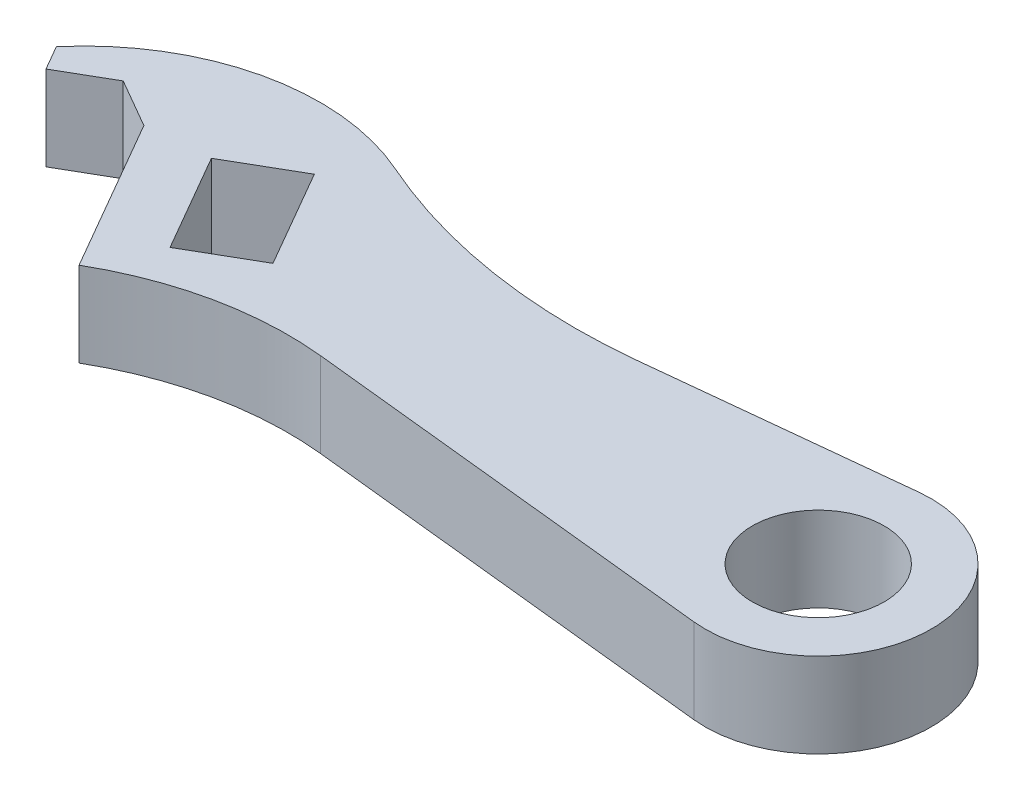
ISO-10303-21;
HEADER;
FILE_DESCRIPTION(('STEP AP214'),'2;1');
FILE_NAME('part.step','',(''),(''),'','','');
FILE_SCHEMA(('AUTOMOTIVE_DESIGN { 1 0 10303 214 1 1 1 1 }'));
ENDSEC;
DATA;
#1=APPLICATION_CONTEXT('core data for automotive mechanical design processes');
#2=APPLICATION_PROTOCOL_DEFINITION('international standard','automotive_design',2000,#1);
#3=PRODUCT_CONTEXT('',#1,'mechanical');
#4=PRODUCT('Part','Part','',(#3));
#5=PRODUCT_RELATED_PRODUCT_CATEGORY('part','',(#4));
#6=PRODUCT_DEFINITION_FORMATION('','',#4);
#7=PRODUCT_DEFINITION_CONTEXT('part definition',#1,'design');
#8=PRODUCT_DEFINITION('design','',#6,#7);
#9=PRODUCT_DEFINITION_SHAPE('','',#8);
#10=(LENGTH_UNIT() NAMED_UNIT(*) SI_UNIT(.MILLI.,.METRE.));
#11=(NAMED_UNIT(*) PLANE_ANGLE_UNIT() SI_UNIT($,.RADIAN.));
#12=(NAMED_UNIT(*) SI_UNIT($,.STERADIAN.) SOLID_ANGLE_UNIT());
#13=UNCERTAINTY_MEASURE_WITH_UNIT(LENGTH_MEASURE(1.E-05),#10,'distance_accuracy_value','');
#14=(GEOMETRIC_REPRESENTATION_CONTEXT(3) GLOBAL_UNCERTAINTY_ASSIGNED_CONTEXT((#13)) GLOBAL_UNIT_ASSIGNED_CONTEXT((#10,
#11,#12)) REPRESENTATION_CONTEXT('',''));
#15=CARTESIAN_POINT('',(0.,0.,0.));
#16=DIRECTION('',(0.,0.,1.));
#17=DIRECTION('',(1.,0.,0.));
#18=AXIS2_PLACEMENT_3D('',#15,#16,#17);
#19=CARTESIAN_POINT('',(-68.8797696951043,4.5,9.00000000000001));
#20=DIRECTION('',(0.,1.,0.));
#21=DIRECTION('',(0.,0.,1.));
#22=AXIS2_PLACEMENT_3D('',#19,#20,#21);
#23=PLANE('',#22);
#24=CARTESIAN_POINT('',(-68.8797696951043,4.5,9.00000000000001));
#25=DIRECTION('',(0.,1.,0.));
#26=DIRECTION('',(0.,0.,1.));
#27=AXIS2_PLACEMENT_3D('',#24,#25,#26);
#28=CIRCLE('',#27,25.);
#29=CARTESIAN_POINT('',(-58.7861227034071,4.5,-13.8717793450138));
#30=VERTEX_POINT('',#29);
#31=CARTESIAN_POINT('',(-88.,4.5,-7.10642086522472));
#32=VERTEX_POINT('',#31);
#33=EDGE_CURVE('E201',#30,#32,#28,.T.);
#34=ORIENTED_EDGE('',*,*,#33,.T.);
#35=DIRECTION('',(0.499999999999996,0.,0.866025403784441));
#36=VECTOR('',#35,1.);
#37=CARTESIAN_POINT('',(-88.,4.5,-7.10642086522472));
#38=LINE('',#37,#36);
#39=CARTESIAN_POINT('',(-86.5,4.5,-4.5083446538714));
#40=VERTEX_POINT('',#39);
#41=EDGE_CURVE('E210',#32,#40,#38,.T.);
#42=ORIENTED_EDGE('',*,*,#41,.T.);
#43=DIRECTION('',(0.866025403784441,0.,-0.499999999999997));
#44=VECTOR('',#43,1.);
#45=CARTESIAN_POINT('',(-86.5,4.5,-4.5083446538714));
#46=LINE('',#45,#44);
#47=CARTESIAN_POINT('',(-81.3038475772934,4.5,-7.50834465387138));
#48=VERTEX_POINT('',#47);
#49=EDGE_CURVE('E211',#40,#48,#46,.T.);
#50=ORIENTED_EDGE('',*,*,#49,.T.);
#51=DIRECTION('',(0.866025403784438,0.,0.500000000000001));
#52=VECTOR('',#51,1.);
#53=CARTESIAN_POINT('',(-81.3038475772934,4.5,-7.50834465387138));
#54=LINE('',#53,#52);
#55=CARTESIAN_POINT('',(-76.1076951545868,4.5,-4.50834465387138));
#56=VERTEX_POINT('',#55);
#57=EDGE_CURVE('E212',#48,#56,#54,.T.);
#58=ORIENTED_EDGE('',*,*,#57,.T.);
#59=DIRECTION('',(0.499999999999998,0.,0.86602540378444));
#60=VECTOR('',#59,1.);
#61=CARTESIAN_POINT('',(-76.1076951545868,4.5,-4.50834465387138));
#62=LINE('',#61,#60);
#63=CARTESIAN_POINT('',(-66.7057713659401,4.5,11.7762650369552));
#64=VERTEX_POINT('',#63);
#65=EDGE_CURVE('E220',#56,#64,#62,.T.);
#66=ORIENTED_EDGE('',*,*,#65,.T.);
#67=CARTESIAN_POINT('',(-49.2057713659402,4.5,42.0871541694106));
#68=DIRECTION('',(0.,-1.,0.));
#69=DIRECTION('',(0.,0.,1.));
#70=AXIS2_PLACEMENT_3D('',#67,#68,#69);
#71=CIRCLE('',#70,35.);
#72=CARTESIAN_POINT('',(-45.5472751515725,4.5,7.278887831521));
#73=VERTEX_POINT('',#72);
#74=EDGE_CURVE('E219',#64,#73,#71,.T.);
#75=ORIENTED_EDGE('',*,*,#74,.T.);
#76=DIRECTION('',(0.994521895368274,0.,0.10452846326765));
#77=VECTOR('',#76,1.);
#78=CARTESIAN_POINT('',(-45.5472751515725,4.5,7.278887831521));
#79=LINE('',#78,#77);
#80=CARTESIAN_POINT('',(-1.2543415592118,4.5,11.9342627444193));
#81=VERTEX_POINT('',#80);
#82=EDGE_CURVE('E224',#73,#81,#79,.T.);
#83=ORIENTED_EDGE('',*,*,#82,.T.);
#84=CARTESIAN_POINT('',(0.,4.5,0.));
#85=DIRECTION('',(0.,1.,0.));
#86=DIRECTION('',(0.,0.,1.));
#87=AXIS2_PLACEMENT_3D('',#84,#85,#86);
#88=CIRCLE('',#87,12.);
#89=CARTESIAN_POINT('',(-1.2543415592118,4.5,-11.9342627444193));
#90=VERTEX_POINT('',#89);
#91=EDGE_CURVE('E227',#81,#90,#88,.T.);
#92=ORIENTED_EDGE('',*,*,#91,.T.);
#93=DIRECTION('',(-0.994521895368274,0.,0.10452846326765));
#94=VECTOR('',#93,1.);
#95=CARTESIAN_POINT('',(-1.2543415592118,4.5,-11.9342627444193));
#96=LINE('',#95,#94);
#97=CARTESIAN_POINT('',(-28.2896621272748,4.5,-9.09273605095071));
#98=VERTEX_POINT('',#97);
#99=EDGE_CURVE('E226',#90,#98,#96,.T.);
#100=ORIENTED_EDGE('',*,*,#99,.T.);
#101=CARTESIAN_POINT('',(-34.5613699233339,4.5,-68.7640497730471));
#102=DIRECTION('',(0.,-1.,0.));
#103=DIRECTION('',(0.,0.,-1.));
#104=AXIS2_PLACEMENT_3D('',#101,#102,#103);
#105=CIRCLE('',#104,60.);
#106=EDGE_CURVE('E232',#98,#30,#105,.T.);
#107=ORIENTED_EDGE('',*,*,#106,.T.);
#108=EDGE_LOOP('',(#34,#42,#50,#58,#66,#75,#83,#92,#100,#107));
#109=FACE_BOUND('',#108,.T.);
#110=CARTESIAN_POINT('',(0.,4.5,0.));
#111=DIRECTION('',(0.,1.,0.));
#112=DIRECTION('',(0.,0.,1.));
#113=AXIS2_PLACEMENT_3D('',#110,#111,#112);
#114=CIRCLE('',#113,7.);
#115=CARTESIAN_POINT('',(0.,4.5,7.));
#116=VERTEX_POINT('',#115);
#117=EDGE_CURVE('E195',#116,#116,#114,.T.);
#118=ORIENTED_EDGE('',*,*,#117,.F.);
#119=EDGE_LOOP('',(#118));
#120=FACE_BOUND('',#119,.T.);
#121=DIRECTION('',(0.499999999999998,0.,0.86602540378444));
#122=VECTOR('',#121,1.);
#123=CARTESIAN_POINT('',(-69.5096189432334,4.5,-5.08014142359585));
#124=LINE('',#123,#122);
#125=CARTESIAN_POINT('',(-69.5096189432334,4.5,-5.08014142359585));
#126=VERTEX_POINT('',#125);
#127=CARTESIAN_POINT('',(-63.5096189432335,4.5,5.31216342181743));
#128=VERTEX_POINT('',#127);
#129=EDGE_CURVE('E156',#126,#128,#124,.T.);
#130=ORIENTED_EDGE('',*,*,#129,.F.);
#131=DIRECTION('',(-0.86602540378444,0.,0.499999999999998));
#132=VECTOR('',#131,1.);
#133=CARTESIAN_POINT('',(-62.5814157129579,4.5,-9.08014142359582));
#134=LINE('',#133,#132);
#135=CARTESIAN_POINT('',(-62.5814157129579,4.5,-9.08014142359582));
#136=VERTEX_POINT('',#135);
#137=EDGE_CURVE('E150',#136,#126,#134,.T.);
#138=ORIENTED_EDGE('',*,*,#137,.F.);
#139=DIRECTION('',(-0.499999999999998,0.,-0.86602540378444));
#140=VECTOR('',#139,1.);
#141=CARTESIAN_POINT('',(-56.5814157129579,4.5,1.31216342181745));
#142=LINE('',#141,#140);
#143=CARTESIAN_POINT('',(-56.5814157129579,4.5,1.31216342181745));
#144=VERTEX_POINT('',#143);
#145=EDGE_CURVE('E174',#144,#136,#142,.T.);
#146=ORIENTED_EDGE('',*,*,#145,.F.);
#147=DIRECTION('',(0.86602540378444,0.,-0.499999999999998));
#148=VECTOR('',#147,1.);
#149=CARTESIAN_POINT('',(-63.5096189432335,4.5,5.31216342181743));
#150=LINE('',#149,#148);
#151=EDGE_CURVE('E166',#128,#144,#150,.T.);
#152=ORIENTED_EDGE('',*,*,#151,.F.);
#153=EDGE_LOOP('',(#130,#138,#146,#152));
#154=FACE_BOUND('',#153,.T.);
#155=ADVANCED_FACE('F44',(#109,#120,#154),#23,.T.);
#156=CARTESIAN_POINT('',(-68.8797696951043,-4.5,9.00000000000001));
#157=DIRECTION('',(0.,1.,0.));
#158=DIRECTION('',(0.,0.,1.));
#159=AXIS2_PLACEMENT_3D('',#156,#157,#158);
#160=PLANE('',#159);
#161=CARTESIAN_POINT('',(0.,-4.5,0.));
#162=DIRECTION('',(0.,1.,0.));
#163=DIRECTION('',(0.,0.,1.));
#164=AXIS2_PLACEMENT_3D('',#161,#162,#163);
#165=CIRCLE('',#164,7.);
#166=CARTESIAN_POINT('',(0.,-4.5,7.));
#167=VERTEX_POINT('',#166);
#168=EDGE_CURVE('E164',#167,#167,#165,.T.);
#169=ORIENTED_EDGE('',*,*,#168,.T.);
#170=EDGE_LOOP('',(#169));
#171=FACE_BOUND('',#170,.T.);
#172=CARTESIAN_POINT('',(-68.8797696951043,-4.5,9.00000000000001));
#173=DIRECTION('',(0.,1.,0.));
#174=DIRECTION('',(0.,0.,1.));
#175=AXIS2_PLACEMENT_3D('',#172,#173,#174);
#176=CIRCLE('',#175,25.);
#177=CARTESIAN_POINT('',(-58.7861227034071,-4.5,-13.8717793450138));
#178=VERTEX_POINT('',#177);
#179=CARTESIAN_POINT('',(-88.,-4.5,-7.10642086522472));
#180=VERTEX_POINT('',#179);
#181=EDGE_CURVE('E200',#178,#180,#176,.T.);
#182=ORIENTED_EDGE('',*,*,#181,.F.);
#183=CARTESIAN_POINT('',(-34.5613699233339,-4.5,-68.7640497730471));
#184=DIRECTION('',(0.,-1.,0.));
#185=DIRECTION('',(0.,0.,-1.));
#186=AXIS2_PLACEMENT_3D('',#183,#184,#185);
#187=CIRCLE('',#186,60.);
#188=CARTESIAN_POINT('',(-28.2896621272748,-4.5,-9.09273605095071));
#189=VERTEX_POINT('',#188);
#190=EDGE_CURVE('E208',#189,#178,#187,.T.);
#191=ORIENTED_EDGE('',*,*,#190,.F.);
#192=DIRECTION('',(-0.994521895368274,0.,0.10452846326765));
#193=VECTOR('',#192,1.);
#194=CARTESIAN_POINT('',(-1.2543415592118,-4.5,-11.9342627444193));
#195=LINE('',#194,#193);
#196=CARTESIAN_POINT('',(-1.2543415592118,-4.5,-11.9342627444193));
#197=VERTEX_POINT('',#196);
#198=EDGE_CURVE('E257',#197,#189,#195,.T.);
#199=ORIENTED_EDGE('',*,*,#198,.F.);
#200=CARTESIAN_POINT('',(0.,-4.5,0.));
#201=DIRECTION('',(0.,1.,0.));
#202=DIRECTION('',(0.,0.,1.));
#203=AXIS2_PLACEMENT_3D('',#200,#201,#202);
#204=CIRCLE('',#203,12.);
#205=CARTESIAN_POINT('',(-1.2543415592118,-4.5,11.9342627444193));
#206=VERTEX_POINT('',#205);
#207=EDGE_CURVE('E260',#206,#197,#204,.T.);
#208=ORIENTED_EDGE('',*,*,#207,.F.);
#209=DIRECTION('',(0.994521895368274,0.,0.10452846326765));
#210=VECTOR('',#209,1.);
#211=CARTESIAN_POINT('',(-45.5472751515725,-4.5,7.278887831521));
#212=LINE('',#211,#210);
#213=CARTESIAN_POINT('',(-45.5472751515725,-4.5,7.278887831521));
#214=VERTEX_POINT('',#213);
#215=EDGE_CURVE('E255',#214,#206,#212,.T.);
#216=ORIENTED_EDGE('',*,*,#215,.F.);
#217=CARTESIAN_POINT('',(-49.2057713659402,-4.5,42.0871541694106));
#218=DIRECTION('',(0.,-1.,0.));
#219=DIRECTION('',(0.,0.,1.));
#220=AXIS2_PLACEMENT_3D('',#217,#218,#219);
#221=CIRCLE('',#220,35.);
#222=CARTESIAN_POINT('',(-66.7057713659401,-4.5,11.7762650369552));
#223=VERTEX_POINT('',#222);
#224=EDGE_CURVE('E253',#223,#214,#221,.T.);
#225=ORIENTED_EDGE('',*,*,#224,.F.);
#226=DIRECTION('',(0.499999999999998,0.,0.86602540378444));
#227=VECTOR('',#226,1.);
#228=CARTESIAN_POINT('',(-76.1076951545868,-4.5,-4.50834465387138));
#229=LINE('',#228,#227);
#230=CARTESIAN_POINT('',(-76.1076951545868,-4.5,-4.50834465387138));
#231=VERTEX_POINT('',#230);
#232=EDGE_CURVE('E249',#231,#223,#229,.T.);
#233=ORIENTED_EDGE('',*,*,#232,.F.);
#234=DIRECTION('',(0.866025403784438,0.,0.500000000000001));
#235=VECTOR('',#234,1.);
#236=CARTESIAN_POINT('',(-81.3038475772934,-4.5,-7.50834465387138));
#237=LINE('',#236,#235);
#238=CARTESIAN_POINT('',(-81.3038475772934,-4.5,-7.50834465387138));
#239=VERTEX_POINT('',#238);
#240=EDGE_CURVE('E243',#239,#231,#237,.T.);
#241=ORIENTED_EDGE('',*,*,#240,.F.);
#242=DIRECTION('',(0.866025403784441,0.,-0.499999999999997));
#243=VECTOR('',#242,1.);
#244=CARTESIAN_POINT('',(-86.5,-4.5,-4.5083446538714));
#245=LINE('',#244,#243);
#246=CARTESIAN_POINT('',(-86.5,-4.5,-4.5083446538714));
#247=VERTEX_POINT('',#246);
#248=EDGE_CURVE('E245',#247,#239,#245,.T.);
#249=ORIENTED_EDGE('',*,*,#248,.F.);
#250=DIRECTION('',(0.499999999999996,0.,0.866025403784441));
#251=VECTOR('',#250,1.);
#252=CARTESIAN_POINT('',(-88.,-4.5,-7.10642086522472));
#253=LINE('',#252,#251);
#254=EDGE_CURVE('E239',#180,#247,#253,.T.);
#255=ORIENTED_EDGE('',*,*,#254,.F.);
#256=EDGE_LOOP('',(#182,#191,#199,#208,#216,#225,#233,#241,#249,#255));
#257=FACE_BOUND('',#256,.T.);
#258=DIRECTION('',(-0.86602540378444,0.,0.499999999999998));
#259=VECTOR('',#258,1.);
#260=CARTESIAN_POINT('',(-62.5814157129579,-4.5,-9.08014142359582));
#261=LINE('',#260,#259);
#262=CARTESIAN_POINT('',(-62.5814157129579,-4.5,-9.08014142359582));
#263=VERTEX_POINT('',#262);
#264=CARTESIAN_POINT('',(-69.5096189432334,-4.5,-5.08014142359585));
#265=VERTEX_POINT('',#264);
#266=EDGE_CURVE('E68',#263,#265,#261,.T.);
#267=ORIENTED_EDGE('',*,*,#266,.T.);
#268=DIRECTION('',(0.499999999999998,0.,0.86602540378444));
#269=VECTOR('',#268,1.);
#270=CARTESIAN_POINT('',(-69.5096189432334,-4.5,-5.08014142359585));
#271=LINE('',#270,#269);
#272=CARTESIAN_POINT('',(-63.5096189432335,-4.5,5.31216342181743));
#273=VERTEX_POINT('',#272);
#274=EDGE_CURVE('E162',#265,#273,#271,.T.);
#275=ORIENTED_EDGE('',*,*,#274,.T.);
#276=DIRECTION('',(0.86602540378444,0.,-0.499999999999998));
#277=VECTOR('',#276,1.);
#278=CARTESIAN_POINT('',(-63.5096189432335,-4.5,5.31216342181743));
#279=LINE('',#278,#277);
#280=CARTESIAN_POINT('',(-56.5814157129579,-4.5,1.31216342181745));
#281=VERTEX_POINT('',#280);
#282=EDGE_CURVE('E185',#273,#281,#279,.T.);
#283=ORIENTED_EDGE('',*,*,#282,.T.);
#284=DIRECTION('',(-0.499999999999998,0.,-0.86602540378444));
#285=VECTOR('',#284,1.);
#286=CARTESIAN_POINT('',(-56.5814157129579,-4.5,1.31216342181745));
#287=LINE('',#286,#285);
#288=EDGE_CURVE('E160',#281,#263,#287,.T.);
#289=ORIENTED_EDGE('',*,*,#288,.T.);
#290=EDGE_LOOP('',(#267,#275,#283,#289));
#291=FACE_BOUND('',#290,.T.);
#292=ADVANCED_FACE('F307',(#171,#257,#291),#160,.F.);
#293=CARTESIAN_POINT('',(-68.8797696951043,4.5,9.00000000000001));
#294=DIRECTION('',(0.,-1.,0.));
#295=DIRECTION('',(0.,0.,-1.));
#296=AXIS2_PLACEMENT_3D('',#293,#294,#295);
#297=CYLINDRICAL_SURFACE('',#296,25.);
#298=ORIENTED_EDGE('',*,*,#181,.T.);
#299=DIRECTION('',(0.,-1.,0.));
#300=VECTOR('',#299,1.);
#301=CARTESIAN_POINT('',(-88.,4.5,-7.10642086522472));
#302=LINE('',#301,#300);
#303=EDGE_CURVE('E11',#32,#180,#302,.T.);
#304=ORIENTED_EDGE('',*,*,#303,.F.);
#305=ORIENTED_EDGE('',*,*,#33,.F.);
#306=DIRECTION('',(0.,-1.,0.));
#307=VECTOR('',#306,1.);
#308=CARTESIAN_POINT('',(-58.7861227034071,4.5,-13.8717793450138));
#309=LINE('',#308,#307);
#310=EDGE_CURVE('E235',#30,#178,#309,.T.);
#311=ORIENTED_EDGE('',*,*,#310,.T.);
#312=EDGE_LOOP('',(#298,#304,#305,#311));
#313=FACE_BOUND('',#312,.T.);
#314=ADVANCED_FACE('F50',(#313),#297,.T.);
#315=CARTESIAN_POINT('',(-88.,4.5,-7.10642086522472));
#316=DIRECTION('',(0.866025403784441,0.,-0.499999999999996));
#317=DIRECTION('',(-0.499999999999996,0.,-0.866025403784441));
#318=AXIS2_PLACEMENT_3D('',#315,#316,#317);
#319=PLANE('',#318);
#320=ORIENTED_EDGE('',*,*,#254,.T.);
#321=DIRECTION('',(0.,-1.,0.));
#322=VECTOR('',#321,1.);
#323=CARTESIAN_POINT('',(-86.5,4.5,-4.5083446538714));
#324=LINE('',#323,#322);
#325=EDGE_CURVE('E53',#40,#247,#324,.T.);
#326=ORIENTED_EDGE('',*,*,#325,.F.);
#327=ORIENTED_EDGE('',*,*,#41,.F.);
#328=ORIENTED_EDGE('',*,*,#303,.T.);
#329=EDGE_LOOP('',(#320,#326,#327,#328));
#330=FACE_BOUND('',#329,.T.);
#331=ADVANCED_FACE('F324',(#330),#319,.F.);
#332=CARTESIAN_POINT('',(-86.5,4.5,-4.5083446538714));
#333=DIRECTION('',(-0.499999999999997,0.,-0.86602540378444));
#334=DIRECTION('',(-0.86602540378444,0.,0.499999999999997));
#335=AXIS2_PLACEMENT_3D('',#332,#333,#334);
#336=PLANE('',#335);
#337=ORIENTED_EDGE('',*,*,#248,.T.);
#338=DIRECTION('',(0.,-1.,0.));
#339=VECTOR('',#338,1.);
#340=CARTESIAN_POINT('',(-81.3038475772934,4.5,-7.50834465387138));
#341=LINE('',#340,#339);
#342=EDGE_CURVE('E295',#48,#239,#341,.T.);
#343=ORIENTED_EDGE('',*,*,#342,.F.);
#344=ORIENTED_EDGE('',*,*,#49,.F.);
#345=ORIENTED_EDGE('',*,*,#325,.T.);
#346=EDGE_LOOP('',(#337,#343,#344,#345));
#347=FACE_BOUND('',#346,.T.);
#348=ADVANCED_FACE('F301',(#347),#336,.F.);
#349=CARTESIAN_POINT('',(-81.3038475772934,4.5,-7.50834465387138));
#350=DIRECTION('',(0.500000000000001,0.,-0.866025403784438));
#351=DIRECTION('',(-0.866025403784438,0.,-0.500000000000001));
#352=AXIS2_PLACEMENT_3D('',#349,#350,#351);
#353=PLANE('',#352);
#354=ORIENTED_EDGE('',*,*,#240,.T.);
#355=DIRECTION('',(0.,-1.,0.));
#356=VECTOR('',#355,1.);
#357=CARTESIAN_POINT('',(-76.1076951545868,4.5,-4.50834465387138));
#358=LINE('',#357,#356);
#359=EDGE_CURVE('E289',#56,#231,#358,.T.);
#360=ORIENTED_EDGE('',*,*,#359,.F.);
#361=ORIENTED_EDGE('',*,*,#57,.F.);
#362=ORIENTED_EDGE('',*,*,#342,.T.);
#363=EDGE_LOOP('',(#354,#360,#361,#362));
#364=FACE_BOUND('',#363,.T.);
#365=ADVANCED_FACE('F311',(#364),#353,.F.);
#366=CARTESIAN_POINT('',(-76.1076951545868,4.5,-4.50834465387138));
#367=DIRECTION('',(0.86602540378444,0.,-0.499999999999998));
#368=DIRECTION('',(-0.499999999999998,0.,-0.86602540378444));
#369=AXIS2_PLACEMENT_3D('',#366,#367,#368);
#370=PLANE('',#369);
#371=ORIENTED_EDGE('',*,*,#232,.T.);
#372=DIRECTION('',(0.,-1.,0.));
#373=VECTOR('',#372,1.);
#374=CARTESIAN_POINT('',(-66.7057713659401,4.5,11.7762650369552));
#375=LINE('',#374,#373);
#376=EDGE_CURVE('E281',#64,#223,#375,.T.);
#377=ORIENTED_EDGE('',*,*,#376,.F.);
#378=ORIENTED_EDGE('',*,*,#65,.F.);
#379=ORIENTED_EDGE('',*,*,#359,.T.);
#380=EDGE_LOOP('',(#371,#377,#378,#379));
#381=FACE_BOUND('',#380,.T.);
#382=ADVANCED_FACE('F320',(#381),#370,.F.);
#383=CARTESIAN_POINT('',(-49.2057713659402,4.5,42.0871541694106));
#384=DIRECTION('',(0.,-1.,0.));
#385=DIRECTION('',(0.,0.,-1.));
#386=AXIS2_PLACEMENT_3D('',#383,#384,#385);
#387=CYLINDRICAL_SURFACE('',#386,35.);
#388=ORIENTED_EDGE('',*,*,#224,.T.);
#389=DIRECTION('',(0.,-1.,0.));
#390=VECTOR('',#389,1.);
#391=CARTESIAN_POINT('',(-45.5472751515725,4.5,7.278887831521));
#392=LINE('',#391,#390);
#393=EDGE_CURVE('E278',#73,#214,#392,.T.);
#394=ORIENTED_EDGE('',*,*,#393,.F.);
#395=ORIENTED_EDGE('',*,*,#74,.F.);
#396=ORIENTED_EDGE('',*,*,#376,.T.);
#397=EDGE_LOOP('',(#388,#394,#395,#396));
#398=FACE_BOUND('',#397,.T.);
#399=ADVANCED_FACE('F346',(#398),#387,.F.);
#400=CARTESIAN_POINT('',(-45.5472751515725,4.5,7.278887831521));
#401=DIRECTION('',(0.10452846326765,0.,-0.994521895368274));
#402=DIRECTION('',(-0.994521895368274,0.,-0.10452846326765));
#403=AXIS2_PLACEMENT_3D('',#400,#401,#402);
#404=PLANE('',#403);
#405=ORIENTED_EDGE('',*,*,#215,.T.);
#406=DIRECTION('',(0.,-1.,0.));
#407=VECTOR('',#406,1.);
#408=CARTESIAN_POINT('',(-1.2543415592118,4.5,11.9342627444193));
#409=LINE('',#408,#407);
#410=EDGE_CURVE('E277',#81,#206,#409,.T.);
#411=ORIENTED_EDGE('',*,*,#410,.F.);
#412=ORIENTED_EDGE('',*,*,#82,.F.);
#413=ORIENTED_EDGE('',*,*,#393,.T.);
#414=EDGE_LOOP('',(#405,#411,#412,#413));
#415=FACE_BOUND('',#414,.T.);
#416=ADVANCED_FACE('F345',(#415),#404,.F.);
#417=CARTESIAN_POINT('',(0.,4.5,0.));
#418=DIRECTION('',(0.,-1.,0.));
#419=DIRECTION('',(0.,0.,-1.));
#420=AXIS2_PLACEMENT_3D('',#417,#418,#419);
#421=CYLINDRICAL_SURFACE('',#420,12.);
#422=ORIENTED_EDGE('',*,*,#207,.T.);
#423=DIRECTION('',(0.,-1.,0.));
#424=VECTOR('',#423,1.);
#425=CARTESIAN_POINT('',(-1.2543415592118,4.5,-11.9342627444193));
#426=LINE('',#425,#424);
#427=EDGE_CURVE('E275',#90,#197,#426,.T.);
#428=ORIENTED_EDGE('',*,*,#427,.F.);
#429=ORIENTED_EDGE('',*,*,#91,.F.);
#430=ORIENTED_EDGE('',*,*,#410,.T.);
#431=EDGE_LOOP('',(#422,#428,#429,#430));
#432=FACE_BOUND('',#431,.T.);
#433=ADVANCED_FACE('F341',(#432),#421,.T.);
#434=CARTESIAN_POINT('',(-1.2543415592118,4.5,-11.9342627444193));
#435=DIRECTION('',(0.10452846326765,0.,0.994521895368274));
#436=DIRECTION('',(0.994521895368274,0.,-0.10452846326765));
#437=AXIS2_PLACEMENT_3D('',#434,#435,#436);
#438=PLANE('',#437);
#439=ORIENTED_EDGE('',*,*,#198,.T.);
#440=DIRECTION('',(0.,-1.,0.));
#441=VECTOR('',#440,1.);
#442=CARTESIAN_POINT('',(-28.2896621272748,4.5,-9.09273605095071));
#443=LINE('',#442,#441);
#444=EDGE_CURVE('E268',#98,#189,#443,.T.);
#445=ORIENTED_EDGE('',*,*,#444,.F.);
#446=ORIENTED_EDGE('',*,*,#99,.F.);
#447=ORIENTED_EDGE('',*,*,#427,.T.);
#448=EDGE_LOOP('',(#439,#445,#446,#447));
#449=FACE_BOUND('',#448,.T.);
#450=ADVANCED_FACE('F340',(#449),#438,.F.);
#451=CARTESIAN_POINT('',(-34.5613699233339,4.5,-68.7640497730471));
#452=DIRECTION('',(0.,-1.,0.));
#453=DIRECTION('',(0.,0.,-1.));
#454=AXIS2_PLACEMENT_3D('',#451,#452,#453);
#455=CYLINDRICAL_SURFACE('',#454,60.);
#456=ORIENTED_EDGE('',*,*,#190,.T.);
#457=ORIENTED_EDGE('',*,*,#310,.F.);
#458=ORIENTED_EDGE('',*,*,#106,.F.);
#459=ORIENTED_EDGE('',*,*,#444,.T.);
#460=EDGE_LOOP('',(#456,#457,#458,#459));
#461=FACE_BOUND('',#460,.T.);
#462=ADVANCED_FACE('F335',(#461),#455,.F.);
#463=CARTESIAN_POINT('',(0.,4.5,0.));
#464=DIRECTION('',(0.,-1.,0.));
#465=DIRECTION('',(0.,0.,-1.));
#466=AXIS2_PLACEMENT_3D('',#463,#464,#465);
#467=CYLINDRICAL_SURFACE('',#466,7.);
#468=ORIENTED_EDGE('',*,*,#117,.T.);
#469=EDGE_LOOP('',(#468));
#470=FACE_BOUND('',#469,.T.);
#471=ORIENTED_EDGE('',*,*,#168,.F.);
#472=EDGE_LOOP('',(#471));
#473=FACE_BOUND('',#472,.T.);
#474=ADVANCED_FACE('F364',(#470,#473),#467,.F.);
#475=CARTESIAN_POINT('',(-62.5814157129579,4.5,-9.08014142359582));
#476=DIRECTION('',(0.499999999999998,0.,0.86602540378444));
#477=DIRECTION('',(0.86602540378444,0.,-0.499999999999998));
#478=AXIS2_PLACEMENT_3D('',#475,#476,#477);
#479=PLANE('',#478);
#480=ORIENTED_EDGE('',*,*,#266,.F.);
#481=DIRECTION('',(0.,-1.,0.));
#482=VECTOR('',#481,1.);
#483=CARTESIAN_POINT('',(-62.5814157129579,4.5,-9.08014142359582));
#484=LINE('',#483,#482);
#485=EDGE_CURVE('E151',#136,#263,#484,.T.);
#486=ORIENTED_EDGE('',*,*,#485,.F.);
#487=ORIENTED_EDGE('',*,*,#137,.T.);
#488=DIRECTION('',(0.,-1.,0.));
#489=VECTOR('',#488,1.);
#490=CARTESIAN_POINT('',(-69.5096189432334,4.5,-5.08014142359585));
#491=LINE('',#490,#489);
#492=EDGE_CURVE('E147',#126,#265,#491,.T.);
#493=ORIENTED_EDGE('',*,*,#492,.T.);
#494=EDGE_LOOP('',(#480,#486,#487,#493));
#495=FACE_BOUND('',#494,.T.);
#496=ADVANCED_FACE('F149',(#495),#479,.T.);
#497=CARTESIAN_POINT('',(-69.5096189432334,4.5,-5.08014142359585));
#498=DIRECTION('',(0.86602540378444,0.,-0.499999999999998));
#499=DIRECTION('',(-0.499999999999998,0.,-0.86602540378444));
#500=AXIS2_PLACEMENT_3D('',#497,#498,#499);
#501=PLANE('',#500);
#502=ORIENTED_EDGE('',*,*,#274,.F.);
#503=ORIENTED_EDGE('',*,*,#492,.F.);
#504=ORIENTED_EDGE('',*,*,#129,.T.);
#505=DIRECTION('',(0.,-1.,0.));
#506=VECTOR('',#505,1.);
#507=CARTESIAN_POINT('',(-63.5096189432335,4.5,5.31216342181743));
#508=LINE('',#507,#506);
#509=EDGE_CURVE('E167',#128,#273,#508,.T.);
#510=ORIENTED_EDGE('',*,*,#509,.T.);
#511=EDGE_LOOP('',(#502,#503,#504,#510));
#512=FACE_BOUND('',#511,.T.);
#513=ADVANCED_FACE('F159',(#512),#501,.T.);
#514=CARTESIAN_POINT('',(-63.5096189432335,4.5,5.31216342181743));
#515=DIRECTION('',(-0.499999999999998,0.,-0.86602540378444));
#516=DIRECTION('',(-0.86602540378444,0.,0.499999999999998));
#517=AXIS2_PLACEMENT_3D('',#514,#515,#516);
#518=PLANE('',#517);
#519=ORIENTED_EDGE('',*,*,#282,.F.);
#520=ORIENTED_EDGE('',*,*,#509,.F.);
#521=ORIENTED_EDGE('',*,*,#151,.T.);
#522=DIRECTION('',(0.,-1.,0.));
#523=VECTOR('',#522,1.);
#524=CARTESIAN_POINT('',(-56.5814157129579,4.5,1.31216342181745));
#525=LINE('',#524,#523);
#526=EDGE_CURVE('E62',#144,#281,#525,.T.);
#527=ORIENTED_EDGE('',*,*,#526,.T.);
#528=EDGE_LOOP('',(#519,#520,#521,#527));
#529=FACE_BOUND('',#528,.T.);
#530=ADVANCED_FACE('F410',(#529),#518,.T.);
#531=CARTESIAN_POINT('',(-56.5814157129579,4.5,1.31216342181745));
#532=DIRECTION('',(-0.86602540378444,0.,0.499999999999998));
#533=DIRECTION('',(0.499999999999998,0.,0.86602540378444));
#534=AXIS2_PLACEMENT_3D('',#531,#532,#533);
#535=PLANE('',#534);
#536=ORIENTED_EDGE('',*,*,#288,.F.);
#537=ORIENTED_EDGE('',*,*,#526,.F.);
#538=ORIENTED_EDGE('',*,*,#145,.T.);
#539=ORIENTED_EDGE('',*,*,#485,.T.);
#540=EDGE_LOOP('',(#536,#537,#538,#539));
#541=FACE_BOUND('',#540,.T.);
#542=ADVANCED_FACE('F415',(#541),#535,.T.);
#543=CLOSED_SHELL('',(#155,#292,#314,#331,#348,#365,#382,#399,#416,#433,#450,#462,#474,#496,
#513,#530,#542));
#544=MANIFOLD_SOLID_BREP('B2',#543);
#545=ADVANCED_BREP_SHAPE_REPRESENTATION('',(#18,#544),#14);
#546=SHAPE_DEFINITION_REPRESENTATION(#9,#545);
ENDSEC;
END-ISO-10303-21;
